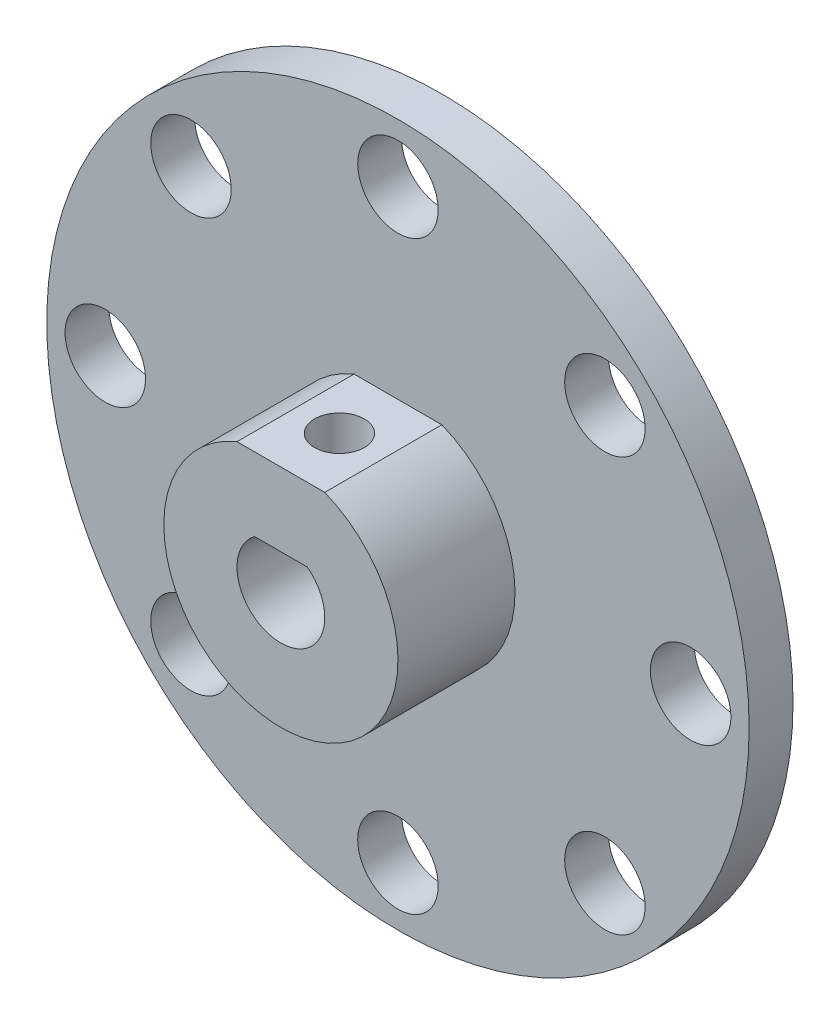
ISO-10303-21;
HEADER;
FILE_DESCRIPTION(('STEP AP214'),'2;1');
FILE_NAME('part.step','',(''),(''),'','','');
FILE_SCHEMA(('AUTOMOTIVE_DESIGN { 1 0 10303 214 1 1 1 1 }'));
ENDSEC;
DATA;
#1=APPLICATION_CONTEXT('core data for automotive mechanical design processes');
#2=APPLICATION_PROTOCOL_DEFINITION('international standard','automotive_design',2000,#1);
#3=PRODUCT_CONTEXT('',#1,'mechanical');
#4=PRODUCT('Part','Part','',(#3));
#5=PRODUCT_RELATED_PRODUCT_CATEGORY('part','',(#4));
#6=PRODUCT_DEFINITION_FORMATION('','',#4);
#7=PRODUCT_DEFINITION_CONTEXT('part definition',#1,'design');
#8=PRODUCT_DEFINITION('design','',#6,#7);
#9=PRODUCT_DEFINITION_SHAPE('','',#8);
#10=(LENGTH_UNIT() NAMED_UNIT(*) SI_UNIT(.MILLI.,.METRE.));
#11=(NAMED_UNIT(*) PLANE_ANGLE_UNIT() SI_UNIT($,.RADIAN.));
#12=(NAMED_UNIT(*) SI_UNIT($,.STERADIAN.) SOLID_ANGLE_UNIT());
#13=UNCERTAINTY_MEASURE_WITH_UNIT(LENGTH_MEASURE(1.E-05),#10,'distance_accuracy_value','');
#14=(GEOMETRIC_REPRESENTATION_CONTEXT(3) GLOBAL_UNCERTAINTY_ASSIGNED_CONTEXT((#13)) GLOBAL_UNIT_ASSIGNED_CONTEXT((#10,
#11,#12)) REPRESENTATION_CONTEXT('',''));
#15=CARTESIAN_POINT('',(0.,0.,0.));
#16=DIRECTION('',(0.,0.,1.));
#17=DIRECTION('',(1.,0.,0.));
#18=AXIS2_PLACEMENT_3D('',#15,#16,#17);
#19=CARTESIAN_POINT('',(-3.,7.41619848709566,-7.52833511066442));
#20=DIRECTION('',(0.,-1.,0.));
#21=DIRECTION('',(0.,0.,-1.));
#22=AXIS2_PLACEMENT_3D('',#19,#20,#21);
#23=PLANE('',#22);
#24=DIRECTION('',(0.,0.,1.));
#25=VECTOR('',#24,1.);
#26=CARTESIAN_POINT('',(-3.,7.41619848709566,-7.52833511066442));
#27=LINE('',#26,#25);
#28=CARTESIAN_POINT('',(-3.,7.41619848709566,-1.5));
#29=VERTEX_POINT('',#28);
#30=CARTESIAN_POINT('',(-3.,7.41619848709566,6.5));
#31=VERTEX_POINT('',#30);
#32=EDGE_CURVE('E94',#29,#31,#27,.T.);
#33=ORIENTED_EDGE('',*,*,#32,.T.);
#34=DIRECTION('',(1.,0.,0.));
#35=VECTOR('',#34,1.);
#36=CARTESIAN_POINT('',(-3.,7.41619848709566,6.5));
#37=LINE('',#36,#35);
#38=CARTESIAN_POINT('',(3.,7.41619848709566,6.5));
#39=VERTEX_POINT('',#38);
#40=EDGE_CURVE('E88',#31,#39,#37,.T.);
#41=ORIENTED_EDGE('',*,*,#40,.T.);
#42=DIRECTION('',(0.,0.,1.));
#43=VECTOR('',#42,1.);
#44=CARTESIAN_POINT('',(3.,7.41619848709566,-7.52833511066442));
#45=LINE('',#44,#43);
#46=CARTESIAN_POINT('',(3.,7.41619848709566,-1.5));
#47=VERTEX_POINT('',#46);
#48=EDGE_CURVE('E85',#47,#39,#45,.T.);
#49=ORIENTED_EDGE('',*,*,#48,.F.);
#50=DIRECTION('',(1.,0.,0.));
#51=VECTOR('',#50,1.);
#52=CARTESIAN_POINT('',(-3.,7.41619848709566,-1.5));
#53=LINE('',#52,#51);
#54=EDGE_CURVE('E61',#29,#47,#53,.T.);
#55=ORIENTED_EDGE('',*,*,#54,.F.);
#56=EDGE_LOOP('',(#33,#41,#49,#55));
#57=FACE_BOUND('',#56,.T.);
#58=CARTESIAN_POINT('',(0.,7.41619848709566,2.5));
#59=DIRECTION('',(0.,1.,0.));
#60=DIRECTION('',(0.,0.,1.));
#61=AXIS2_PLACEMENT_3D('',#58,#59,#60);
#62=CIRCLE('',#61,1.7);
#63=CARTESIAN_POINT('',(0.,7.41619848709566,4.2));
#64=VERTEX_POINT('',#63);
#65=EDGE_CURVE('E328',#64,#64,#62,.T.);
#66=ORIENTED_EDGE('',*,*,#65,.F.);
#67=EDGE_LOOP('',(#66));
#68=FACE_BOUND('',#67,.T.);
#69=ADVANCED_FACE('F45',(#57,#68),#23,.F.);
#70=CARTESIAN_POINT('',(0.,9.,-4.5));
#71=DIRECTION('',(0.,0.,1.));
#72=DIRECTION('',(1.,0.,0.));
#73=AXIS2_PLACEMENT_3D('',#70,#71,#72);
#74=PLANE('',#73);
#75=CARTESIAN_POINT('',(0.,20.,-4.5));
#76=DIRECTION('',(0.,0.,-1.));
#77=DIRECTION('',(-1.,0.,0.));
#78=AXIS2_PLACEMENT_3D('',#75,#76,#77);
#79=CIRCLE('',#78,2.74999999999999);
#80=CARTESIAN_POINT('',(-2.74999999999999,20.,-4.5));
#81=VERTEX_POINT('',#80);
#82=EDGE_CURVE('E338',#81,#81,#79,.T.);
#83=ORIENTED_EDGE('',*,*,#82,.F.);
#84=EDGE_LOOP('',(#83));
#85=FACE_BOUND('',#84,.T.);
#86=CARTESIAN_POINT('',(-14.1421356237311,14.1421356237313,-4.5));
#87=DIRECTION('',(0.,0.,-1.));
#88=DIRECTION('',(-1.,0.,0.));
#89=AXIS2_PLACEMENT_3D('',#86,#87,#88);
#90=CIRCLE('',#89,2.74999999999999);
#91=CARTESIAN_POINT('',(-16.8921356237311,14.1421356237313,-4.5));
#92=VERTEX_POINT('',#91);
#93=EDGE_CURVE('E346',#92,#92,#90,.T.);
#94=ORIENTED_EDGE('',*,*,#93,.F.);
#95=EDGE_LOOP('',(#94));
#96=FACE_BOUND('',#95,.T.);
#97=CARTESIAN_POINT('',(-20.0000000000005,4.94318298034202E-13,-4.5));
#98=DIRECTION('',(0.,0.,-1.));
#99=DIRECTION('',(-1.,0.,0.));
#100=AXIS2_PLACEMENT_3D('',#97,#98,#99);
#101=CIRCLE('',#100,2.74999999999999);
#102=CARTESIAN_POINT('',(-22.7500000000005,4.94318298034202E-13,-4.5));
#103=VERTEX_POINT('',#102);
#104=EDGE_CURVE('E354',#103,#103,#101,.T.);
#105=ORIENTED_EDGE('',*,*,#104,.F.);
#106=EDGE_LOOP('',(#105));
#107=FACE_BOUND('',#106,.T.);
#108=CARTESIAN_POINT('',(-9.88636596068404E-13,-20.,-4.5));
#109=DIRECTION('',(0.,0.,-1.));
#110=DIRECTION('',(-1.,0.,0.));
#111=AXIS2_PLACEMENT_3D('',#108,#109,#110);
#112=CIRCLE('',#111,2.74999999999999);
#113=CARTESIAN_POINT('',(-2.75000000000098,-20.,-4.5));
#114=VERTEX_POINT('',#113);
#115=EDGE_CURVE('E370',#114,#114,#112,.T.);
#116=ORIENTED_EDGE('',*,*,#115,.F.);
#117=EDGE_LOOP('',(#116));
#118=FACE_BOUND('',#117,.T.);
#119=CARTESIAN_POINT('',(14.1421356237301,-14.1421356237313,-4.5));
#120=DIRECTION('',(0.,0.,-1.));
#121=DIRECTION('',(-1.,0.,0.));
#122=AXIS2_PLACEMENT_3D('',#119,#120,#121);
#123=CIRCLE('',#122,2.74999999999999);
#124=CARTESIAN_POINT('',(11.3921356237301,-14.1421356237313,-4.5));
#125=VERTEX_POINT('',#124);
#126=EDGE_CURVE('E378',#125,#125,#123,.T.);
#127=ORIENTED_EDGE('',*,*,#126,.F.);
#128=EDGE_LOOP('',(#127));
#129=FACE_BOUND('',#128,.T.);
#130=CARTESIAN_POINT('',(19.9999999999995,-4.96767591632497E-13,-4.5));
#131=DIRECTION('',(0.,0.,-1.));
#132=DIRECTION('',(-1.,0.,0.));
#133=AXIS2_PLACEMENT_3D('',#130,#131,#132);
#134=CIRCLE('',#133,2.74999999999999);
#135=CARTESIAN_POINT('',(17.2499999999995,-4.96767591632497E-13,-4.5));
#136=VERTEX_POINT('',#135);
#137=EDGE_CURVE('E386',#136,#136,#134,.T.);
#138=ORIENTED_EDGE('',*,*,#137,.F.);
#139=EDGE_LOOP('',(#138));
#140=FACE_BOUND('',#139,.T.);
#141=CARTESIAN_POINT('',(14.1421356237308,14.1421356237306,-4.5));
#142=DIRECTION('',(0.,0.,-1.));
#143=DIRECTION('',(-1.,0.,0.));
#144=AXIS2_PLACEMENT_3D('',#141,#142,#143);
#145=CIRCLE('',#144,2.74999999999999);
#146=CARTESIAN_POINT('',(11.3921356237308,14.1421356237306,-4.5));
#147=VERTEX_POINT('',#146);
#148=EDGE_CURVE('E394',#147,#147,#145,.T.);
#149=ORIENTED_EDGE('',*,*,#148,.F.);
#150=EDGE_LOOP('',(#149));
#151=FACE_BOUND('',#150,.T.);
#152=CARTESIAN_POINT('',(0.,0.,-4.5));
#153=DIRECTION('',(0.,0.,1.));
#154=DIRECTION('',(1.,0.,0.));
#155=AXIS2_PLACEMENT_3D('',#152,#153,#154);
#156=CIRCLE('',#155,24.);
#157=CARTESIAN_POINT('',(24.,0.,-4.5));
#158=VERTEX_POINT('',#157);
#159=EDGE_CURVE('E111',#158,#158,#156,.T.);
#160=ORIENTED_EDGE('',*,*,#159,.F.);
#161=EDGE_LOOP('',(#160));
#162=FACE_BOUND('',#161,.T.);
#163=CARTESIAN_POINT('',(0.,0.,-4.5));
#164=DIRECTION('',(0.,0.,1.));
#165=DIRECTION('',(1.,0.,0.));
#166=AXIS2_PLACEMENT_3D('',#163,#164,#165);
#167=CIRCLE('',#166,9.);
#168=CARTESIAN_POINT('',(9.,0.,-4.5));
#169=VERTEX_POINT('',#168);
#170=EDGE_CURVE('E54',#169,#169,#167,.T.);
#171=ORIENTED_EDGE('',*,*,#170,.T.);
#172=EDGE_LOOP('',(#171));
#173=FACE_BOUND('',#172,.T.);
#174=CARTESIAN_POINT('',(-14.1421356237318,-14.1421356237306,-4.5));
#175=DIRECTION('',(0.,0.,-1.));
#176=DIRECTION('',(-1.,0.,0.));
#177=AXIS2_PLACEMENT_3D('',#174,#175,#176);
#178=CIRCLE('',#177,2.74999999999999);
#179=CARTESIAN_POINT('',(-16.8921356237318,-14.1421356237306,-4.5));
#180=VERTEX_POINT('',#179);
#181=EDGE_CURVE('E362',#180,#180,#178,.T.);
#182=ORIENTED_EDGE('',*,*,#181,.F.);
#183=EDGE_LOOP('',(#182));
#184=FACE_BOUND('',#183,.T.);
#185=ADVANCED_FACE('F123',(#85,#96,#107,#118,#129,#140,#151,#162,#173,#184),#74,.F.);
#186=CARTESIAN_POINT('',(0.,8.,6.5));
#187=DIRECTION('',(0.,0.,-1.));
#188=DIRECTION('',(-1.,0.,0.));
#189=AXIS2_PLACEMENT_3D('',#186,#187,#188);
#190=PLANE('',#189);
#191=DIRECTION('',(-1.,0.,0.));
#192=VECTOR('',#191,1.);
#193=CARTESIAN_POINT('',(-1.8,2.4,6.5));
#194=LINE('',#193,#192);
#195=CARTESIAN_POINT('',(1.8,2.4,6.5));
#196=VERTEX_POINT('',#195);
#197=CARTESIAN_POINT('',(-1.8,2.4,6.5));
#198=VERTEX_POINT('',#197);
#199=EDGE_CURVE('E407',#196,#198,#194,.T.);
#200=ORIENTED_EDGE('',*,*,#199,.F.);
#201=CARTESIAN_POINT('',(0.,0.,6.5));
#202=DIRECTION('',(0.,0.,1.));
#203=DIRECTION('',(1.,0.,0.));
#204=AXIS2_PLACEMENT_3D('',#201,#202,#203);
#205=CIRCLE('',#204,3.);
#206=EDGE_CURVE('E69',#198,#196,#205,.T.);
#207=ORIENTED_EDGE('',*,*,#206,.F.);
#208=EDGE_LOOP('',(#200,#207));
#209=FACE_BOUND('',#208,.T.);
#210=CARTESIAN_POINT('',(0.,0.,6.5));
#211=DIRECTION('',(0.,0.,1.));
#212=DIRECTION('',(1.,0.,0.));
#213=AXIS2_PLACEMENT_3D('',#210,#211,#212);
#214=CIRCLE('',#213,8.);
#215=EDGE_CURVE('E106',#31,#39,#214,.T.);
#216=ORIENTED_EDGE('',*,*,#215,.T.);
#217=ORIENTED_EDGE('',*,*,#40,.F.);
#218=EDGE_LOOP('',(#216,#217));
#219=FACE_BOUND('',#218,.T.);
#220=ADVANCED_FACE('F47',(#209,#219),#190,.F.);
#221=CARTESIAN_POINT('',(0.,0.,-6.5));
#222=DIRECTION('',(0.,0.,1.));
#223=DIRECTION('',(1.,0.,0.));
#224=AXIS2_PLACEMENT_3D('',#221,#222,#223);
#225=PLANE('',#224);
#226=CARTESIAN_POINT('',(0.,0.,-6.5));
#227=DIRECTION('',(0.,0.,1.));
#228=DIRECTION('',(1.,0.,0.));
#229=AXIS2_PLACEMENT_3D('',#226,#227,#228);
#230=CIRCLE('',#229,9.);
#231=CARTESIAN_POINT('',(9.,0.,-6.5));
#232=VERTEX_POINT('',#231);
#233=EDGE_CURVE('E11',#232,#232,#230,.T.);
#234=ORIENTED_EDGE('',*,*,#233,.F.);
#235=EDGE_LOOP('',(#234));
#236=FACE_BOUND('',#235,.T.);
#237=ADVANCED_FACE('F130',(#236),#225,.F.);
#238=CARTESIAN_POINT('',(0.,0.,25.6232345338686));
#239=DIRECTION('',(0.,0.,1.));
#240=DIRECTION('',(1.,0.,0.));
#241=AXIS2_PLACEMENT_3D('',#238,#239,#240);
#242=CYLINDRICAL_SURFACE('',#241,9.);
#243=ORIENTED_EDGE('',*,*,#170,.F.);
#244=EDGE_LOOP('',(#243));
#245=FACE_BOUND('',#244,.T.);
#246=ORIENTED_EDGE('',*,*,#233,.T.);
#247=EDGE_LOOP('',(#246));
#248=FACE_BOUND('',#247,.T.);
#249=ADVANCED_FACE('F126',(#245,#248),#242,.T.);
#250=CARTESIAN_POINT('',(0.,0.,25.6232345338686));
#251=DIRECTION('',(0.,0.,1.));
#252=DIRECTION('',(1.,0.,0.));
#253=AXIS2_PLACEMENT_3D('',#250,#251,#252);
#254=CYLINDRICAL_SURFACE('',#253,24.);
#255=CARTESIAN_POINT('',(0.,0.,-1.5));
#256=DIRECTION('',(0.,0.,1.));
#257=DIRECTION('',(1.,0.,0.));
#258=AXIS2_PLACEMENT_3D('',#255,#256,#257);
#259=CIRCLE('',#258,24.);
#260=CARTESIAN_POINT('',(24.,0.,-1.5));
#261=VERTEX_POINT('',#260);
#262=EDGE_CURVE('E105',#261,#261,#259,.T.);
#263=ORIENTED_EDGE('',*,*,#262,.F.);
#264=EDGE_LOOP('',(#263));
#265=FACE_BOUND('',#264,.T.);
#266=ORIENTED_EDGE('',*,*,#159,.T.);
#267=EDGE_LOOP('',(#266));
#268=FACE_BOUND('',#267,.T.);
#269=ADVANCED_FACE('F129',(#265,#268),#254,.T.);
#270=CARTESIAN_POINT('',(0.,24.,-1.5));
#271=DIRECTION('',(0.,0.,-1.));
#272=DIRECTION('',(-1.,0.,0.));
#273=AXIS2_PLACEMENT_3D('',#270,#271,#272);
#274=PLANE('',#273);
#275=CARTESIAN_POINT('',(0.,20.,-1.5));
#276=DIRECTION('',(0.,0.,-1.));
#277=DIRECTION('',(-1.,0.,0.));
#278=AXIS2_PLACEMENT_3D('',#275,#276,#277);
#279=CIRCLE('',#278,2.74999999999999);
#280=CARTESIAN_POINT('',(-2.74999999999999,20.,-1.5));
#281=VERTEX_POINT('',#280);
#282=EDGE_CURVE('E342',#281,#281,#279,.T.);
#283=ORIENTED_EDGE('',*,*,#282,.T.);
#284=EDGE_LOOP('',(#283));
#285=FACE_BOUND('',#284,.T.);
#286=CARTESIAN_POINT('',(-14.1421356237311,14.1421356237313,-1.5));
#287=DIRECTION('',(0.,0.,-1.));
#288=DIRECTION('',(-1.,0.,0.));
#289=AXIS2_PLACEMENT_3D('',#286,#287,#288);
#290=CIRCLE('',#289,2.74999999999999);
#291=CARTESIAN_POINT('',(-16.8921356237311,14.1421356237313,-1.5));
#292=VERTEX_POINT('',#291);
#293=EDGE_CURVE('E350',#292,#292,#290,.T.);
#294=ORIENTED_EDGE('',*,*,#293,.T.);
#295=EDGE_LOOP('',(#294));
#296=FACE_BOUND('',#295,.T.);
#297=CARTESIAN_POINT('',(-20.0000000000005,4.94318298034202E-13,-1.5));
#298=DIRECTION('',(0.,0.,-1.));
#299=DIRECTION('',(-1.,0.,0.));
#300=AXIS2_PLACEMENT_3D('',#297,#298,#299);
#301=CIRCLE('',#300,2.74999999999999);
#302=CARTESIAN_POINT('',(-22.7500000000005,4.94318298034202E-13,-1.5));
#303=VERTEX_POINT('',#302);
#304=EDGE_CURVE('E358',#303,#303,#301,.T.);
#305=ORIENTED_EDGE('',*,*,#304,.T.);
#306=EDGE_LOOP('',(#305));
#307=FACE_BOUND('',#306,.T.);
#308=CARTESIAN_POINT('',(-14.1421356237318,-14.1421356237306,-1.5));
#309=DIRECTION('',(0.,0.,-1.));
#310=DIRECTION('',(-1.,0.,0.));
#311=AXIS2_PLACEMENT_3D('',#308,#309,#310);
#312=CIRCLE('',#311,2.74999999999999);
#313=CARTESIAN_POINT('',(-16.8921356237318,-14.1421356237306,-1.5));
#314=VERTEX_POINT('',#313);
#315=EDGE_CURVE('E366',#314,#314,#312,.T.);
#316=ORIENTED_EDGE('',*,*,#315,.T.);
#317=EDGE_LOOP('',(#316));
#318=FACE_BOUND('',#317,.T.);
#319=CARTESIAN_POINT('',(-9.88636596068404E-13,-20.,-1.5));
#320=DIRECTION('',(0.,0.,-1.));
#321=DIRECTION('',(-1.,0.,0.));
#322=AXIS2_PLACEMENT_3D('',#319,#320,#321);
#323=CIRCLE('',#322,2.74999999999999);
#324=CARTESIAN_POINT('',(-2.75000000000098,-20.,-1.5));
#325=VERTEX_POINT('',#324);
#326=EDGE_CURVE('E374',#325,#325,#323,.T.);
#327=ORIENTED_EDGE('',*,*,#326,.T.);
#328=EDGE_LOOP('',(#327));
#329=FACE_BOUND('',#328,.T.);
#330=CARTESIAN_POINT('',(14.1421356237301,-14.1421356237313,-1.5));
#331=DIRECTION('',(0.,0.,-1.));
#332=DIRECTION('',(-1.,0.,0.));
#333=AXIS2_PLACEMENT_3D('',#330,#331,#332);
#334=CIRCLE('',#333,2.75);
#335=CARTESIAN_POINT('',(11.3921356237301,-14.1421356237313,-1.5));
#336=VERTEX_POINT('',#335);
#337=EDGE_CURVE('E382',#336,#336,#334,.T.);
#338=ORIENTED_EDGE('',*,*,#337,.T.);
#339=EDGE_LOOP('',(#338));
#340=FACE_BOUND('',#339,.T.);
#341=CARTESIAN_POINT('',(19.9999999999995,-4.96767591632497E-13,-1.5));
#342=DIRECTION('',(0.,0.,-1.));
#343=DIRECTION('',(-1.,0.,0.));
#344=AXIS2_PLACEMENT_3D('',#341,#342,#343);
#345=CIRCLE('',#344,2.74999999999999);
#346=CARTESIAN_POINT('',(17.2499999999995,-4.96767591632497E-13,-1.5));
#347=VERTEX_POINT('',#346);
#348=EDGE_CURVE('E390',#347,#347,#345,.T.);
#349=ORIENTED_EDGE('',*,*,#348,.T.);
#350=EDGE_LOOP('',(#349));
#351=FACE_BOUND('',#350,.T.);
#352=CARTESIAN_POINT('',(14.1421356237308,14.1421356237306,-1.5));
#353=DIRECTION('',(0.,0.,-1.));
#354=DIRECTION('',(-1.,0.,0.));
#355=AXIS2_PLACEMENT_3D('',#352,#353,#354);
#356=CIRCLE('',#355,2.75);
#357=CARTESIAN_POINT('',(11.3921356237308,14.1421356237306,-1.5));
#358=VERTEX_POINT('',#357);
#359=EDGE_CURVE('E398',#358,#358,#356,.T.);
#360=ORIENTED_EDGE('',*,*,#359,.T.);
#361=EDGE_LOOP('',(#360));
#362=FACE_BOUND('',#361,.T.);
#363=CARTESIAN_POINT('',(0.,0.,-1.5));
#364=DIRECTION('',(0.,0.,1.));
#365=DIRECTION('',(1.,0.,0.));
#366=AXIS2_PLACEMENT_3D('',#363,#364,#365);
#367=CIRCLE('',#366,8.);
#368=EDGE_CURVE('E100',#29,#47,#367,.T.);
#369=ORIENTED_EDGE('',*,*,#368,.F.);
#370=ORIENTED_EDGE('',*,*,#54,.T.);
#371=EDGE_LOOP('',(#369,#370));
#372=FACE_BOUND('',#371,.T.);
#373=ORIENTED_EDGE('',*,*,#262,.T.);
#374=EDGE_LOOP('',(#373));
#375=FACE_BOUND('',#374,.T.);
#376=ADVANCED_FACE('F98',(#285,#296,#307,#318,#329,#340,#351,#362,#372,#375),#274,.F.);
#377=CARTESIAN_POINT('',(0.,0.,25.6232345338686));
#378=DIRECTION('',(0.,0.,1.));
#379=DIRECTION('',(1.,0.,0.));
#380=AXIS2_PLACEMENT_3D('',#377,#378,#379);
#381=CYLINDRICAL_SURFACE('',#380,8.);
#382=ORIENTED_EDGE('',*,*,#368,.T.);
#383=ORIENTED_EDGE('',*,*,#48,.T.);
#384=ORIENTED_EDGE('',*,*,#215,.F.);
#385=ORIENTED_EDGE('',*,*,#32,.F.);
#386=EDGE_LOOP('',(#382,#383,#384,#385));
#387=FACE_BOUND('',#386,.T.);
#388=ADVANCED_FACE('F103',(#387),#381,.T.);
#389=CARTESIAN_POINT('',(0.,0.,-3.5));
#390=DIRECTION('',(0.,0.,1.));
#391=DIRECTION('',(1.,0.,0.));
#392=AXIS2_PLACEMENT_3D('',#389,#390,#391);
#393=CYLINDRICAL_SURFACE('',#392,3.);
#394=ORIENTED_EDGE('',*,*,#206,.T.);
#395=DIRECTION('',(0.,0.,1.));
#396=VECTOR('',#395,1.);
#397=CARTESIAN_POINT('',(1.8,2.4,-3.5));
#398=LINE('',#397,#396);
#399=CARTESIAN_POINT('',(1.8,2.4,-3.5));
#400=VERTEX_POINT('',#399);
#401=EDGE_CURVE('E411',#400,#196,#398,.T.);
#402=ORIENTED_EDGE('',*,*,#401,.F.);
#403=CARTESIAN_POINT('',(0.,0.,-3.5));
#404=DIRECTION('',(0.,0.,1.));
#405=DIRECTION('',(1.,0.,0.));
#406=AXIS2_PLACEMENT_3D('',#403,#404,#405);
#407=CIRCLE('',#406,3.);
#408=CARTESIAN_POINT('',(-1.8,2.4,-3.5));
#409=VERTEX_POINT('',#408);
#410=EDGE_CURVE('E402',#409,#400,#407,.T.);
#411=ORIENTED_EDGE('',*,*,#410,.F.);
#412=DIRECTION('',(0.,0.,1.));
#413=VECTOR('',#412,1.);
#414=CARTESIAN_POINT('',(-1.8,2.4,-3.5));
#415=LINE('',#414,#413);
#416=EDGE_CURVE('E113',#409,#198,#415,.T.);
#417=ORIENTED_EDGE('',*,*,#416,.T.);
#418=EDGE_LOOP('',(#394,#402,#411,#417));
#419=FACE_BOUND('',#418,.T.);
#420=ADVANCED_FACE('F189',(#419),#393,.F.);
#421=CARTESIAN_POINT('',(-1.8,2.4,-3.5));
#422=DIRECTION('',(0.,1.,0.));
#423=DIRECTION('',(0.,0.,1.));
#424=AXIS2_PLACEMENT_3D('',#421,#422,#423);
#425=PLANE('',#424);
#426=CARTESIAN_POINT('',(0.,2.4,2.5));
#427=DIRECTION('',(0.,1.,0.));
#428=DIRECTION('',(0.,0.,1.));
#429=AXIS2_PLACEMENT_3D('',#426,#427,#428);
#430=CIRCLE('',#429,1.7);
#431=CARTESIAN_POINT('',(0.,2.4,4.2));
#432=VERTEX_POINT('',#431);
#433=EDGE_CURVE('E325',#432,#432,#430,.T.);
#434=ORIENTED_EDGE('',*,*,#433,.T.);
#435=EDGE_LOOP('',(#434));
#436=FACE_BOUND('',#435,.T.);
#437=ORIENTED_EDGE('',*,*,#199,.T.);
#438=ORIENTED_EDGE('',*,*,#416,.F.);
#439=DIRECTION('',(-1.,0.,0.));
#440=VECTOR('',#439,1.);
#441=CARTESIAN_POINT('',(-1.8,2.4,-3.5));
#442=LINE('',#441,#440);
#443=EDGE_CURVE('E406',#400,#409,#442,.T.);
#444=ORIENTED_EDGE('',*,*,#443,.F.);
#445=ORIENTED_EDGE('',*,*,#401,.T.);
#446=EDGE_LOOP('',(#437,#438,#444,#445));
#447=FACE_BOUND('',#446,.T.);
#448=ADVANCED_FACE('F186',(#436,#447),#425,.F.);
#449=CARTESIAN_POINT('',(0.,0.,-3.5));
#450=DIRECTION('',(0.,0.,1.));
#451=DIRECTION('',(1.,0.,0.));
#452=AXIS2_PLACEMENT_3D('',#449,#450,#451);
#453=PLANE('',#452);
#454=ORIENTED_EDGE('',*,*,#410,.T.);
#455=ORIENTED_EDGE('',*,*,#443,.T.);
#456=EDGE_LOOP('',(#454,#455));
#457=FACE_BOUND('',#456,.T.);
#458=ADVANCED_FACE('F182',(#457),#453,.T.);
#459=CARTESIAN_POINT('',(14.1421356237308,14.1421356237306,-4.5));
#460=DIRECTION('',(0.,0.,-1.));
#461=DIRECTION('',(-1.,0.,0.));
#462=AXIS2_PLACEMENT_3D('',#459,#460,#461);
#463=CYLINDRICAL_SURFACE('',#462,2.75);
#464=ORIENTED_EDGE('',*,*,#359,.F.);
#465=EDGE_LOOP('',(#464));
#466=FACE_BOUND('',#465,.T.);
#467=ORIENTED_EDGE('',*,*,#148,.T.);
#468=EDGE_LOOP('',(#467));
#469=FACE_BOUND('',#468,.T.);
#470=ADVANCED_FACE('F178',(#466,#469),#463,.F.);
#471=CARTESIAN_POINT('',(19.9999999999995,-4.96767591632497E-13,-4.5));
#472=DIRECTION('',(0.,0.,-1.));
#473=DIRECTION('',(-1.,0.,0.));
#474=AXIS2_PLACEMENT_3D('',#471,#472,#473);
#475=CYLINDRICAL_SURFACE('',#474,2.74999999999999);
#476=ORIENTED_EDGE('',*,*,#348,.F.);
#477=EDGE_LOOP('',(#476));
#478=FACE_BOUND('',#477,.T.);
#479=ORIENTED_EDGE('',*,*,#137,.T.);
#480=EDGE_LOOP('',(#479));
#481=FACE_BOUND('',#480,.T.);
#482=ADVANCED_FACE('F174',(#478,#481),#475,.F.);
#483=CARTESIAN_POINT('',(14.1421356237301,-14.1421356237313,-4.5));
#484=DIRECTION('',(0.,0.,-1.));
#485=DIRECTION('',(-1.,0.,0.));
#486=AXIS2_PLACEMENT_3D('',#483,#484,#485);
#487=CYLINDRICAL_SURFACE('',#486,2.75);
#488=ORIENTED_EDGE('',*,*,#337,.F.);
#489=EDGE_LOOP('',(#488));
#490=FACE_BOUND('',#489,.T.);
#491=ORIENTED_EDGE('',*,*,#126,.T.);
#492=EDGE_LOOP('',(#491));
#493=FACE_BOUND('',#492,.T.);
#494=ADVANCED_FACE('F170',(#490,#493),#487,.F.);
#495=CARTESIAN_POINT('',(-9.88636596068404E-13,-20.,-4.5));
#496=DIRECTION('',(0.,0.,-1.));
#497=DIRECTION('',(-1.,0.,0.));
#498=AXIS2_PLACEMENT_3D('',#495,#496,#497);
#499=CYLINDRICAL_SURFACE('',#498,2.74999999999999);
#500=ORIENTED_EDGE('',*,*,#326,.F.);
#501=EDGE_LOOP('',(#500));
#502=FACE_BOUND('',#501,.T.);
#503=ORIENTED_EDGE('',*,*,#115,.T.);
#504=EDGE_LOOP('',(#503));
#505=FACE_BOUND('',#504,.T.);
#506=ADVANCED_FACE('F166',(#502,#505),#499,.F.);
#507=CARTESIAN_POINT('',(-14.1421356237318,-14.1421356237306,-4.5));
#508=DIRECTION('',(0.,0.,-1.));
#509=DIRECTION('',(-1.,0.,0.));
#510=AXIS2_PLACEMENT_3D('',#507,#508,#509);
#511=CYLINDRICAL_SURFACE('',#510,2.74999999999999);
#512=ORIENTED_EDGE('',*,*,#315,.F.);
#513=EDGE_LOOP('',(#512));
#514=FACE_BOUND('',#513,.T.);
#515=ORIENTED_EDGE('',*,*,#181,.T.);
#516=EDGE_LOOP('',(#515));
#517=FACE_BOUND('',#516,.T.);
#518=ADVANCED_FACE('F162',(#514,#517),#511,.F.);
#519=CARTESIAN_POINT('',(-20.0000000000005,4.94318298034202E-13,-4.5));
#520=DIRECTION('',(0.,0.,-1.));
#521=DIRECTION('',(-1.,0.,0.));
#522=AXIS2_PLACEMENT_3D('',#519,#520,#521);
#523=CYLINDRICAL_SURFACE('',#522,2.74999999999999);
#524=ORIENTED_EDGE('',*,*,#304,.F.);
#525=EDGE_LOOP('',(#524));
#526=FACE_BOUND('',#525,.T.);
#527=ORIENTED_EDGE('',*,*,#104,.T.);
#528=EDGE_LOOP('',(#527));
#529=FACE_BOUND('',#528,.T.);
#530=ADVANCED_FACE('F158',(#526,#529),#523,.F.);
#531=CARTESIAN_POINT('',(-14.1421356237311,14.1421356237313,-4.5));
#532=DIRECTION('',(0.,0.,-1.));
#533=DIRECTION('',(-1.,0.,0.));
#534=AXIS2_PLACEMENT_3D('',#531,#532,#533);
#535=CYLINDRICAL_SURFACE('',#534,2.74999999999999);
#536=ORIENTED_EDGE('',*,*,#293,.F.);
#537=EDGE_LOOP('',(#536));
#538=FACE_BOUND('',#537,.T.);
#539=ORIENTED_EDGE('',*,*,#93,.T.);
#540=EDGE_LOOP('',(#539));
#541=FACE_BOUND('',#540,.T.);
#542=ADVANCED_FACE('F154',(#538,#541),#535,.F.);
#543=CARTESIAN_POINT('',(0.,20.,-4.5));
#544=DIRECTION('',(0.,0.,-1.));
#545=DIRECTION('',(-1.,0.,0.));
#546=AXIS2_PLACEMENT_3D('',#543,#544,#545);
#547=CYLINDRICAL_SURFACE('',#546,2.74999999999999);
#548=ORIENTED_EDGE('',*,*,#282,.F.);
#549=EDGE_LOOP('',(#548));
#550=FACE_BOUND('',#549,.T.);
#551=ORIENTED_EDGE('',*,*,#82,.T.);
#552=EDGE_LOOP('',(#551));
#553=FACE_BOUND('',#552,.T.);
#554=ADVANCED_FACE('F151',(#550,#553),#547,.F.);
#555=CARTESIAN_POINT('',(0.,7.41619848709566,2.5));
#556=DIRECTION('',(0.,1.,0.));
#557=DIRECTION('',(0.,0.,1.));
#558=AXIS2_PLACEMENT_3D('',#555,#556,#557);
#559=CYLINDRICAL_SURFACE('',#558,1.7);
#560=ORIENTED_EDGE('',*,*,#433,.F.);
#561=EDGE_LOOP('',(#560));
#562=FACE_BOUND('',#561,.T.);
#563=ORIENTED_EDGE('',*,*,#65,.T.);
#564=EDGE_LOOP('',(#563));
#565=FACE_BOUND('',#564,.T.);
#566=ADVANCED_FACE('F150',(#562,#565),#559,.F.);
#567=CLOSED_SHELL('',(#69,#185,#220,#237,#249,#269,#376,#388,#420,#448,#458,#470,#482,#494,#506,
#518,#530,#542,#554,#566));
#568=MANIFOLD_SOLID_BREP('B2',#567);
#569=ADVANCED_BREP_SHAPE_REPRESENTATION('',(#18,#568),#14);
#570=SHAPE_DEFINITION_REPRESENTATION(#9,#569);
ENDSEC;
END-ISO-10303-21;
